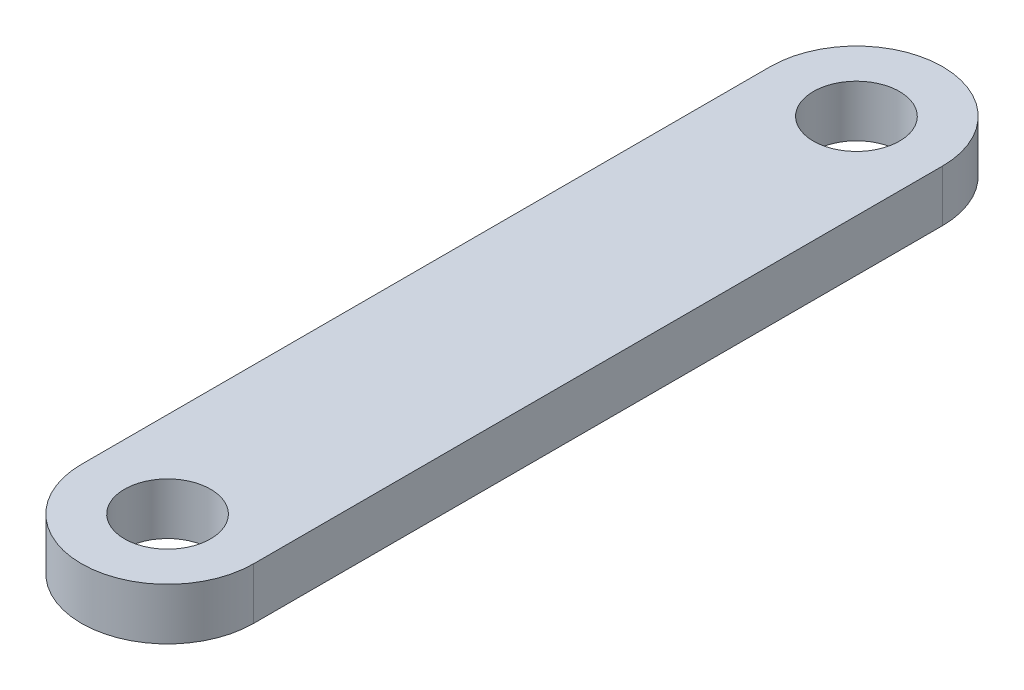
ISO-10303-21;
HEADER;
FILE_DESCRIPTION(('STEP AP214'),'2;1');
FILE_NAME('part.step','',(''),(''),'','','');
FILE_SCHEMA(('AUTOMOTIVE_DESIGN { 1 0 10303 214 1 1 1 1 }'));
ENDSEC;
DATA;
#1=APPLICATION_CONTEXT('core data for automotive mechanical design processes');
#2=APPLICATION_PROTOCOL_DEFINITION('international standard','automotive_design',2000,#1);
#3=PRODUCT_CONTEXT('',#1,'mechanical');
#4=PRODUCT('Part','Part','',(#3));
#5=PRODUCT_RELATED_PRODUCT_CATEGORY('part','',(#4));
#6=PRODUCT_DEFINITION_FORMATION('','',#4);
#7=PRODUCT_DEFINITION_CONTEXT('part definition',#1,'design');
#8=PRODUCT_DEFINITION('design','',#6,#7);
#9=PRODUCT_DEFINITION_SHAPE('','',#8);
#10=(LENGTH_UNIT() NAMED_UNIT(*) SI_UNIT(.MILLI.,.METRE.));
#11=(NAMED_UNIT(*) PLANE_ANGLE_UNIT() SI_UNIT($,.RADIAN.));
#12=(NAMED_UNIT(*) SI_UNIT($,.STERADIAN.) SOLID_ANGLE_UNIT());
#13=UNCERTAINTY_MEASURE_WITH_UNIT(LENGTH_MEASURE(1.E-05),#10,'distance_accuracy_value','');
#14=(GEOMETRIC_REPRESENTATION_CONTEXT(3) GLOBAL_UNCERTAINTY_ASSIGNED_CONTEXT((#13)) GLOBAL_UNIT_ASSIGNED_CONTEXT((#10,
#11,#12)) REPRESENTATION_CONTEXT('',''));
#15=CARTESIAN_POINT('',(0.,0.,0.));
#16=DIRECTION('',(0.,0.,1.));
#17=DIRECTION('',(1.,0.,0.));
#18=AXIS2_PLACEMENT_3D('',#15,#16,#17);
#19=CARTESIAN_POINT('',(0.,12.,0.));
#20=DIRECTION('',(0.,-1.,0.));
#21=DIRECTION('',(0.,0.,-1.));
#22=AXIS2_PLACEMENT_3D('',#19,#20,#21);
#23=CYLINDRICAL_SURFACE('',#22,20.);
#24=CARTESIAN_POINT('',(0.,0.,0.));
#25=DIRECTION('',(0.,1.,0.));
#26=DIRECTION('',(0.,0.,1.));
#27=AXIS2_PLACEMENT_3D('',#24,#25,#26);
#28=CIRCLE('',#27,20.);
#29=CARTESIAN_POINT('',(-20.,0.,0.));
#30=VERTEX_POINT('',#29);
#31=CARTESIAN_POINT('',(20.,0.,0.));
#32=VERTEX_POINT('',#31);
#33=EDGE_CURVE('E116',#30,#32,#28,.T.);
#34=ORIENTED_EDGE('',*,*,#33,.T.);
#35=DIRECTION('',(0.,-1.,0.));
#36=VECTOR('',#35,1.);
#37=CARTESIAN_POINT('',(20.,12.,0.));
#38=LINE('',#37,#36);
#39=CARTESIAN_POINT('',(20.,12.,0.));
#40=VERTEX_POINT('',#39);
#41=EDGE_CURVE('E11',#40,#32,#38,.T.);
#42=ORIENTED_EDGE('',*,*,#41,.F.);
#43=CARTESIAN_POINT('',(0.,12.,0.));
#44=DIRECTION('',(0.,1.,0.));
#45=DIRECTION('',(0.,0.,1.));
#46=AXIS2_PLACEMENT_3D('',#43,#44,#45);
#47=CIRCLE('',#46,20.);
#48=CARTESIAN_POINT('',(-20.,12.,0.));
#49=VERTEX_POINT('',#48);
#50=EDGE_CURVE('E99',#49,#40,#47,.T.);
#51=ORIENTED_EDGE('',*,*,#50,.F.);
#52=DIRECTION('',(0.,-1.,0.));
#53=VECTOR('',#52,1.);
#54=CARTESIAN_POINT('',(-20.,12.,0.));
#55=LINE('',#54,#53);
#56=EDGE_CURVE('E112',#49,#30,#55,.T.);
#57=ORIENTED_EDGE('',*,*,#56,.T.);
#58=EDGE_LOOP('',(#34,#42,#51,#57));
#59=FACE_BOUND('',#58,.T.);
#60=ADVANCED_FACE('F45',(#59),#23,.T.);
#61=CARTESIAN_POINT('',(20.,12.,0.));
#62=DIRECTION('',(-1.,0.,0.));
#63=DIRECTION('',(0.,0.,1.));
#64=AXIS2_PLACEMENT_3D('',#61,#62,#63);
#65=PLANE('',#64);
#66=DIRECTION('',(0.,0.,-1.));
#67=VECTOR('',#66,1.);
#68=CARTESIAN_POINT('',(20.,0.,0.));
#69=LINE('',#68,#67);
#70=CARTESIAN_POINT('',(20.,0.,-160.));
#71=VERTEX_POINT('',#70);
#72=EDGE_CURVE('E104',#32,#71,#69,.T.);
#73=ORIENTED_EDGE('',*,*,#72,.T.);
#74=DIRECTION('',(0.,-1.,0.));
#75=VECTOR('',#74,1.);
#76=CARTESIAN_POINT('',(20.,12.,-160.));
#77=LINE('',#76,#75);
#78=CARTESIAN_POINT('',(20.,12.,-160.));
#79=VERTEX_POINT('',#78);
#80=EDGE_CURVE('E55',#79,#71,#77,.T.);
#81=ORIENTED_EDGE('',*,*,#80,.F.);
#82=DIRECTION('',(0.,0.,-1.));
#83=VECTOR('',#82,1.);
#84=CARTESIAN_POINT('',(20.,12.,0.));
#85=LINE('',#84,#83);
#86=EDGE_CURVE('E94',#40,#79,#85,.T.);
#87=ORIENTED_EDGE('',*,*,#86,.F.);
#88=ORIENTED_EDGE('',*,*,#41,.T.);
#89=EDGE_LOOP('',(#73,#81,#87,#88));
#90=FACE_BOUND('',#89,.T.);
#91=ADVANCED_FACE('F103',(#90),#65,.F.);
#92=CARTESIAN_POINT('',(0.,12.,-160.));
#93=DIRECTION('',(0.,-1.,0.));
#94=DIRECTION('',(0.,0.,-1.));
#95=AXIS2_PLACEMENT_3D('',#92,#93,#94);
#96=CYLINDRICAL_SURFACE('',#95,20.);
#97=CARTESIAN_POINT('',(0.,0.,-160.));
#98=DIRECTION('',(0.,1.,0.));
#99=DIRECTION('',(0.,0.,1.));
#100=AXIS2_PLACEMENT_3D('',#97,#98,#99);
#101=CIRCLE('',#100,20.);
#102=CARTESIAN_POINT('',(-20.,0.,-160.));
#103=VERTEX_POINT('',#102);
#104=EDGE_CURVE('E81',#71,#103,#101,.T.);
#105=ORIENTED_EDGE('',*,*,#104,.T.);
#106=DIRECTION('',(0.,-1.,0.));
#107=VECTOR('',#106,1.);
#108=CARTESIAN_POINT('',(-20.,12.,-160.));
#109=LINE('',#108,#107);
#110=CARTESIAN_POINT('',(-20.,12.,-160.));
#111=VERTEX_POINT('',#110);
#112=EDGE_CURVE('E106',#111,#103,#109,.T.);
#113=ORIENTED_EDGE('',*,*,#112,.F.);
#114=CARTESIAN_POINT('',(0.,12.,-160.));
#115=DIRECTION('',(0.,1.,0.));
#116=DIRECTION('',(0.,0.,1.));
#117=AXIS2_PLACEMENT_3D('',#114,#115,#116);
#118=CIRCLE('',#117,20.);
#119=EDGE_CURVE('E97',#79,#111,#118,.T.);
#120=ORIENTED_EDGE('',*,*,#119,.F.);
#121=ORIENTED_EDGE('',*,*,#80,.T.);
#122=EDGE_LOOP('',(#105,#113,#120,#121));
#123=FACE_BOUND('',#122,.T.);
#124=ADVANCED_FACE('F108',(#123),#96,.T.);
#125=CARTESIAN_POINT('',(-20.,12.,0.));
#126=DIRECTION('',(1.,0.,0.));
#127=DIRECTION('',(0.,0.,-1.));
#128=AXIS2_PLACEMENT_3D('',#125,#126,#127);
#129=PLANE('',#128);
#130=DIRECTION('',(0.,0.,1.));
#131=VECTOR('',#130,1.);
#132=CARTESIAN_POINT('',(-20.,0.,0.));
#133=LINE('',#132,#131);
#134=EDGE_CURVE('E87',#103,#30,#133,.T.);
#135=ORIENTED_EDGE('',*,*,#134,.T.);
#136=ORIENTED_EDGE('',*,*,#56,.F.);
#137=DIRECTION('',(0.,0.,1.));
#138=VECTOR('',#137,1.);
#139=CARTESIAN_POINT('',(-20.,12.,0.));
#140=LINE('',#139,#138);
#141=EDGE_CURVE('E64',#111,#49,#140,.T.);
#142=ORIENTED_EDGE('',*,*,#141,.F.);
#143=ORIENTED_EDGE('',*,*,#112,.T.);
#144=EDGE_LOOP('',(#135,#136,#142,#143));
#145=FACE_BOUND('',#144,.T.);
#146=ADVANCED_FACE('F155',(#145),#129,.F.);
#147=CARTESIAN_POINT('',(0.,12.,0.));
#148=DIRECTION('',(0.,1.,0.));
#149=DIRECTION('',(0.,0.,1.));
#150=AXIS2_PLACEMENT_3D('',#147,#148,#149);
#151=PLANE('',#150);
#152=CARTESIAN_POINT('',(0.,12.,0.));
#153=DIRECTION('',(0.,1.,0.));
#154=DIRECTION('',(0.,0.,1.));
#155=AXIS2_PLACEMENT_3D('',#152,#153,#154);
#156=CIRCLE('',#155,10.);
#157=CARTESIAN_POINT('',(0.,12.,10.));
#158=VERTEX_POINT('',#157);
#159=EDGE_CURVE('E142',#158,#158,#156,.T.);
#160=ORIENTED_EDGE('',*,*,#159,.F.);
#161=EDGE_LOOP('',(#160));
#162=FACE_BOUND('',#161,.T.);
#163=CARTESIAN_POINT('',(0.,12.,-160.));
#164=DIRECTION('',(0.,1.,0.));
#165=DIRECTION('',(0.,0.,1.));
#166=AXIS2_PLACEMENT_3D('',#163,#164,#165);
#167=CIRCLE('',#166,10.);
#168=CARTESIAN_POINT('',(0.,12.,-150.));
#169=VERTEX_POINT('',#168);
#170=EDGE_CURVE('E132',#169,#169,#167,.T.);
#171=ORIENTED_EDGE('',*,*,#170,.F.);
#172=EDGE_LOOP('',(#171));
#173=FACE_BOUND('',#172,.T.);
#174=ORIENTED_EDGE('',*,*,#50,.T.);
#175=ORIENTED_EDGE('',*,*,#86,.T.);
#176=ORIENTED_EDGE('',*,*,#119,.T.);
#177=ORIENTED_EDGE('',*,*,#141,.T.);
#178=EDGE_LOOP('',(#174,#175,#176,#177));
#179=FACE_BOUND('',#178,.T.);
#180=ADVANCED_FACE('F95',(#162,#173,#179),#151,.T.);
#181=CARTESIAN_POINT('',(0.,0.,0.));
#182=DIRECTION('',(0.,1.,0.));
#183=DIRECTION('',(0.,0.,1.));
#184=AXIS2_PLACEMENT_3D('',#181,#182,#183);
#185=PLANE('',#184);
#186=CARTESIAN_POINT('',(0.,0.,0.));
#187=DIRECTION('',(0.,1.,0.));
#188=DIRECTION('',(0.,0.,1.));
#189=AXIS2_PLACEMENT_3D('',#186,#187,#188);
#190=CIRCLE('',#189,10.);
#191=CARTESIAN_POINT('',(0.,0.,10.));
#192=VERTEX_POINT('',#191);
#193=EDGE_CURVE('E48',#192,#192,#190,.T.);
#194=ORIENTED_EDGE('',*,*,#193,.T.);
#195=EDGE_LOOP('',(#194));
#196=FACE_BOUND('',#195,.T.);
#197=CARTESIAN_POINT('',(0.,0.,-160.));
#198=DIRECTION('',(0.,1.,0.));
#199=DIRECTION('',(0.,0.,1.));
#200=AXIS2_PLACEMENT_3D('',#197,#198,#199);
#201=CIRCLE('',#200,10.);
#202=CARTESIAN_POINT('',(0.,0.,-150.));
#203=VERTEX_POINT('',#202);
#204=EDGE_CURVE('E120',#203,#203,#201,.T.);
#205=ORIENTED_EDGE('',*,*,#204,.T.);
#206=EDGE_LOOP('',(#205));
#207=FACE_BOUND('',#206,.T.);
#208=ORIENTED_EDGE('',*,*,#33,.F.);
#209=ORIENTED_EDGE('',*,*,#134,.F.);
#210=ORIENTED_EDGE('',*,*,#104,.F.);
#211=ORIENTED_EDGE('',*,*,#72,.F.);
#212=EDGE_LOOP('',(#208,#209,#210,#211));
#213=FACE_BOUND('',#212,.T.);
#214=ADVANCED_FACE('F154',(#196,#207,#213),#185,.F.);
#215=CARTESIAN_POINT('',(0.,-18.,-160.));
#216=DIRECTION('',(0.,1.,0.));
#217=DIRECTION('',(0.,0.,1.));
#218=AXIS2_PLACEMENT_3D('',#215,#216,#217);
#219=CYLINDRICAL_SURFACE('',#218,10.);
#220=ORIENTED_EDGE('',*,*,#170,.T.);
#221=EDGE_LOOP('',(#220));
#222=FACE_BOUND('',#221,.T.);
#223=ORIENTED_EDGE('',*,*,#204,.F.);
#224=EDGE_LOOP('',(#223));
#225=FACE_BOUND('',#224,.T.);
#226=ADVANCED_FACE('F161',(#222,#225),#219,.F.);
#227=CARTESIAN_POINT('',(0.,-18.,0.));
#228=DIRECTION('',(0.,1.,0.));
#229=DIRECTION('',(0.,0.,1.));
#230=AXIS2_PLACEMENT_3D('',#227,#228,#229);
#231=CYLINDRICAL_SURFACE('',#230,10.);
#232=ORIENTED_EDGE('',*,*,#159,.T.);
#233=EDGE_LOOP('',(#232));
#234=FACE_BOUND('',#233,.T.);
#235=ORIENTED_EDGE('',*,*,#193,.F.);
#236=EDGE_LOOP('',(#235));
#237=FACE_BOUND('',#236,.T.);
#238=ADVANCED_FACE('F149',(#234,#237),#231,.F.);
#239=CLOSED_SHELL('',(#60,#91,#124,#146,#180,#214,#226,#238));
#240=MANIFOLD_SOLID_BREP('B2',#239);
#241=ADVANCED_BREP_SHAPE_REPRESENTATION('',(#18,#240),#14);
#242=SHAPE_DEFINITION_REPRESENTATION(#9,#241);
ENDSEC;
END-ISO-10303-21;
